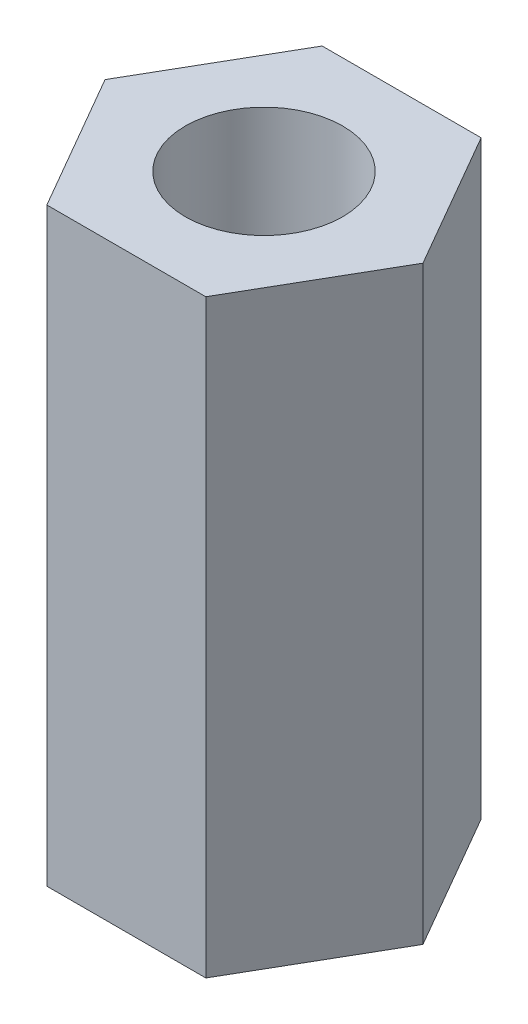
ISO-10303-21;
HEADER;
FILE_DESCRIPTION(('STEP AP214'),'2;1');
FILE_NAME('part.step','',(''),(''),'','','');
FILE_SCHEMA(('AUTOMOTIVE_DESIGN { 1 0 10303 214 1 1 1 1 }'));
ENDSEC;
DATA;
#1=APPLICATION_CONTEXT('core data for automotive mechanical design processes');
#2=APPLICATION_PROTOCOL_DEFINITION('international standard','automotive_design',2000,#1);
#3=PRODUCT_CONTEXT('',#1,'mechanical');
#4=PRODUCT('Part','Part','',(#3));
#5=PRODUCT_RELATED_PRODUCT_CATEGORY('part','',(#4));
#6=PRODUCT_DEFINITION_FORMATION('','',#4);
#7=PRODUCT_DEFINITION_CONTEXT('part definition',#1,'design');
#8=PRODUCT_DEFINITION('design','',#6,#7);
#9=PRODUCT_DEFINITION_SHAPE('','',#8);
#10=(LENGTH_UNIT() NAMED_UNIT(*) SI_UNIT(.MILLI.,.METRE.));
#11=(NAMED_UNIT(*) PLANE_ANGLE_UNIT() SI_UNIT($,.RADIAN.));
#12=(NAMED_UNIT(*) SI_UNIT($,.STERADIAN.) SOLID_ANGLE_UNIT());
#13=UNCERTAINTY_MEASURE_WITH_UNIT(LENGTH_MEASURE(1.E-05),#10,'distance_accuracy_value','');
#14=(GEOMETRIC_REPRESENTATION_CONTEXT(3) GLOBAL_UNCERTAINTY_ASSIGNED_CONTEXT((#13)) GLOBAL_UNIT_ASSIGNED_CONTEXT((#10,
#11,#12)) REPRESENTATION_CONTEXT('',''));
#15=CARTESIAN_POINT('',(0.,0.,0.));
#16=DIRECTION('',(0.,0.,1.));
#17=DIRECTION('',(1.,0.,0.));
#18=AXIS2_PLACEMENT_3D('',#15,#16,#17);
#19=CARTESIAN_POINT('',(0.,15.,0.));
#20=DIRECTION('',(0.,1.,0.));
#21=DIRECTION('',(0.,0.,1.));
#22=AXIS2_PLACEMENT_3D('',#19,#20,#21);
#23=PLANE('',#22);
#24=DIRECTION('',(0.5,0.,-0.866025403784439));
#25=VECTOR('',#24,1.);
#26=CARTESIAN_POINT('',(2.02072594216369,15.,3.5));
#27=LINE('',#26,#25);
#28=CARTESIAN_POINT('',(2.02072594216369,15.,3.5));
#29=VERTEX_POINT('',#28);
#30=CARTESIAN_POINT('',(4.04145188432738,15.,0.));
#31=VERTEX_POINT('',#30);
#32=EDGE_CURVE('E131',#29,#31,#27,.T.);
#33=ORIENTED_EDGE('',*,*,#32,.T.);
#34=DIRECTION('',(-0.5,0.,-0.866025403784439));
#35=VECTOR('',#34,1.);
#36=CARTESIAN_POINT('',(4.04145188432738,15.,0.));
#37=LINE('',#36,#35);
#38=CARTESIAN_POINT('',(2.02072594216369,15.,-3.5));
#39=VERTEX_POINT('',#38);
#40=EDGE_CURVE('E89',#31,#39,#37,.T.);
#41=ORIENTED_EDGE('',*,*,#40,.T.);
#42=DIRECTION('',(-1.,0.,0.));
#43=VECTOR('',#42,1.);
#44=CARTESIAN_POINT('',(2.02072594216369,15.,-3.5));
#45=LINE('',#44,#43);
#46=CARTESIAN_POINT('',(-2.02072594216369,15.,-3.5));
#47=VERTEX_POINT('',#46);
#48=EDGE_CURVE('E102',#39,#47,#45,.T.);
#49=ORIENTED_EDGE('',*,*,#48,.T.);
#50=DIRECTION('',(-0.5,0.,0.866025403784439));
#51=VECTOR('',#50,1.);
#52=CARTESIAN_POINT('',(-2.02072594216369,15.,-3.5));
#53=LINE('',#52,#51);
#54=CARTESIAN_POINT('',(-4.04145188432738,15.,0.));
#55=VERTEX_POINT('',#54);
#56=EDGE_CURVE('E96',#47,#55,#53,.T.);
#57=ORIENTED_EDGE('',*,*,#56,.T.);
#58=DIRECTION('',(0.5,0.,0.866025403784439));
#59=VECTOR('',#58,1.);
#60=CARTESIAN_POINT('',(-4.04145188432738,15.,0.));
#61=LINE('',#60,#59);
#62=CARTESIAN_POINT('',(-2.02072594216369,15.,3.5));
#63=VERTEX_POINT('',#62);
#64=EDGE_CURVE('E100',#55,#63,#61,.T.);
#65=ORIENTED_EDGE('',*,*,#64,.T.);
#66=DIRECTION('',(1.,0.,0.));
#67=VECTOR('',#66,1.);
#68=CARTESIAN_POINT('',(-2.02072594216369,15.,3.5));
#69=LINE('',#68,#67);
#70=EDGE_CURVE('E52',#63,#29,#69,.T.);
#71=ORIENTED_EDGE('',*,*,#70,.T.);
#72=EDGE_LOOP('',(#33,#41,#49,#57,#65,#71));
#73=FACE_BOUND('',#72,.T.);
#74=CARTESIAN_POINT('',(0.,15.,0.));
#75=DIRECTION('',(0.,1.,0.));
#76=DIRECTION('',(0.,0.,1.));
#77=AXIS2_PLACEMENT_3D('',#74,#75,#76);
#78=CIRCLE('',#77,2.);
#79=CARTESIAN_POINT('',(0.,15.,2.));
#80=VERTEX_POINT('',#79);
#81=EDGE_CURVE('E124',#80,#80,#78,.T.);
#82=ORIENTED_EDGE('',*,*,#81,.F.);
#83=EDGE_LOOP('',(#82));
#84=FACE_BOUND('',#83,.T.);
#85=ADVANCED_FACE('F35',(#73,#84),#23,.T.);
#86=CARTESIAN_POINT('',(0.,0.,0.));
#87=DIRECTION('',(0.,1.,0.));
#88=DIRECTION('',(0.,0.,1.));
#89=AXIS2_PLACEMENT_3D('',#86,#87,#88);
#90=PLANE('',#89);
#91=DIRECTION('',(0.5,0.,-0.866025403784439));
#92=VECTOR('',#91,1.);
#93=CARTESIAN_POINT('',(2.02072594216369,0.,3.5));
#94=LINE('',#93,#92);
#95=CARTESIAN_POINT('',(2.02072594216369,0.,3.5));
#96=VERTEX_POINT('',#95);
#97=CARTESIAN_POINT('',(4.04145188432738,0.,0.));
#98=VERTEX_POINT('',#97);
#99=EDGE_CURVE('E120',#96,#98,#94,.T.);
#100=ORIENTED_EDGE('',*,*,#99,.F.);
#101=DIRECTION('',(1.,0.,0.));
#102=VECTOR('',#101,1.);
#103=CARTESIAN_POINT('',(-2.02072594216369,0.,3.5));
#104=LINE('',#103,#102);
#105=CARTESIAN_POINT('',(-2.02072594216369,0.,3.5));
#106=VERTEX_POINT('',#105);
#107=EDGE_CURVE('E81',#106,#96,#104,.T.);
#108=ORIENTED_EDGE('',*,*,#107,.F.);
#109=DIRECTION('',(0.5,0.,0.866025403784439));
#110=VECTOR('',#109,1.);
#111=CARTESIAN_POINT('',(-4.04145188432738,0.,0.));
#112=LINE('',#111,#110);
#113=CARTESIAN_POINT('',(-4.04145188432738,0.,0.));
#114=VERTEX_POINT('',#113);
#115=EDGE_CURVE('E75',#114,#106,#112,.T.);
#116=ORIENTED_EDGE('',*,*,#115,.F.);
#117=DIRECTION('',(-0.5,0.,0.866025403784439));
#118=VECTOR('',#117,1.);
#119=CARTESIAN_POINT('',(-2.02072594216369,0.,-3.5));
#120=LINE('',#119,#118);
#121=CARTESIAN_POINT('',(-2.02072594216369,0.,-3.5));
#122=VERTEX_POINT('',#121);
#123=EDGE_CURVE('E110',#122,#114,#120,.T.);
#124=ORIENTED_EDGE('',*,*,#123,.F.);
#125=DIRECTION('',(-1.,0.,0.));
#126=VECTOR('',#125,1.);
#127=CARTESIAN_POINT('',(2.02072594216369,0.,-3.5));
#128=LINE('',#127,#126);
#129=CARTESIAN_POINT('',(2.02072594216369,0.,-3.5));
#130=VERTEX_POINT('',#129);
#131=EDGE_CURVE('E126',#130,#122,#128,.T.);
#132=ORIENTED_EDGE('',*,*,#131,.F.);
#133=DIRECTION('',(-0.5,0.,-0.866025403784439));
#134=VECTOR('',#133,1.);
#135=CARTESIAN_POINT('',(4.04145188432738,0.,0.));
#136=LINE('',#135,#134);
#137=EDGE_CURVE('E123',#98,#130,#136,.T.);
#138=ORIENTED_EDGE('',*,*,#137,.F.);
#139=EDGE_LOOP('',(#100,#108,#116,#124,#132,#138));
#140=FACE_BOUND('',#139,.T.);
#141=CARTESIAN_POINT('',(0.,0.,0.));
#142=DIRECTION('',(0.,1.,0.));
#143=DIRECTION('',(0.,0.,1.));
#144=AXIS2_PLACEMENT_3D('',#141,#142,#143);
#145=CIRCLE('',#144,2.);
#146=CARTESIAN_POINT('',(0.,0.,2.));
#147=VERTEX_POINT('',#146);
#148=EDGE_CURVE('E224',#147,#147,#145,.T.);
#149=ORIENTED_EDGE('',*,*,#148,.T.);
#150=EDGE_LOOP('',(#149));
#151=FACE_BOUND('',#150,.T.);
#152=ADVANCED_FACE('F140',(#140,#151),#90,.F.);
#153=CARTESIAN_POINT('',(2.02072594216369,15.,3.5));
#154=DIRECTION('',(-0.866025403784439,0.,-0.5));
#155=DIRECTION('',(-0.5,0.,0.866025403784439));
#156=AXIS2_PLACEMENT_3D('',#153,#154,#155);
#157=PLANE('',#156);
#158=ORIENTED_EDGE('',*,*,#99,.T.);
#159=DIRECTION('',(0.,-1.,0.));
#160=VECTOR('',#159,1.);
#161=CARTESIAN_POINT('',(4.04145188432738,15.,0.));
#162=LINE('',#161,#160);
#163=EDGE_CURVE('E11',#31,#98,#162,.T.);
#164=ORIENTED_EDGE('',*,*,#163,.F.);
#165=ORIENTED_EDGE('',*,*,#32,.F.);
#166=DIRECTION('',(0.,-1.,0.));
#167=VECTOR('',#166,1.);
#168=CARTESIAN_POINT('',(2.02072594216369,15.,3.5));
#169=LINE('',#168,#167);
#170=EDGE_CURVE('E116',#29,#96,#169,.T.);
#171=ORIENTED_EDGE('',*,*,#170,.T.);
#172=EDGE_LOOP('',(#158,#164,#165,#171));
#173=FACE_BOUND('',#172,.T.);
#174=ADVANCED_FACE('F37',(#173),#157,.F.);
#175=CARTESIAN_POINT('',(4.04145188432738,15.,0.));
#176=DIRECTION('',(-0.866025403784438,0.,0.5));
#177=DIRECTION('',(0.5,0.,0.866025403784439));
#178=AXIS2_PLACEMENT_3D('',#175,#176,#177);
#179=PLANE('',#178);
#180=ORIENTED_EDGE('',*,*,#137,.T.);
#181=DIRECTION('',(0.,-1.,0.));
#182=VECTOR('',#181,1.);
#183=CARTESIAN_POINT('',(2.02072594216369,15.,-3.5));
#184=LINE('',#183,#182);
#185=EDGE_CURVE('E44',#39,#130,#184,.T.);
#186=ORIENTED_EDGE('',*,*,#185,.F.);
#187=ORIENTED_EDGE('',*,*,#40,.F.);
#188=ORIENTED_EDGE('',*,*,#163,.T.);
#189=EDGE_LOOP('',(#180,#186,#187,#188));
#190=FACE_BOUND('',#189,.T.);
#191=ADVANCED_FACE('F165',(#190),#179,.F.);
#192=CARTESIAN_POINT('',(2.02072594216369,15.,-3.5));
#193=DIRECTION('',(0.,0.,1.));
#194=DIRECTION('',(1.,0.,0.));
#195=AXIS2_PLACEMENT_3D('',#192,#193,#194);
#196=PLANE('',#195);
#197=ORIENTED_EDGE('',*,*,#131,.T.);
#198=DIRECTION('',(0.,-1.,0.));
#199=VECTOR('',#198,1.);
#200=CARTESIAN_POINT('',(-2.02072594216369,15.,-3.5));
#201=LINE('',#200,#199);
#202=EDGE_CURVE('E111',#47,#122,#201,.T.);
#203=ORIENTED_EDGE('',*,*,#202,.F.);
#204=ORIENTED_EDGE('',*,*,#48,.F.);
#205=ORIENTED_EDGE('',*,*,#185,.T.);
#206=EDGE_LOOP('',(#197,#203,#204,#205));
#207=FACE_BOUND('',#206,.T.);
#208=ADVANCED_FACE('F137',(#207),#196,.F.);
#209=CARTESIAN_POINT('',(-2.02072594216369,15.,-3.5));
#210=DIRECTION('',(0.866025403784439,0.,0.5));
#211=DIRECTION('',(0.5,0.,-0.866025403784439));
#212=AXIS2_PLACEMENT_3D('',#209,#210,#211);
#213=PLANE('',#212);
#214=ORIENTED_EDGE('',*,*,#123,.T.);
#215=DIRECTION('',(0.,-1.,0.));
#216=VECTOR('',#215,1.);
#217=CARTESIAN_POINT('',(-4.04145188432738,15.,0.));
#218=LINE('',#217,#216);
#219=EDGE_CURVE('E107',#55,#114,#218,.T.);
#220=ORIENTED_EDGE('',*,*,#219,.F.);
#221=ORIENTED_EDGE('',*,*,#56,.F.);
#222=ORIENTED_EDGE('',*,*,#202,.T.);
#223=EDGE_LOOP('',(#214,#220,#221,#222));
#224=FACE_BOUND('',#223,.T.);
#225=ADVANCED_FACE('F108',(#224),#213,.F.);
#226=CARTESIAN_POINT('',(-4.04145188432738,15.,0.));
#227=DIRECTION('',(0.866025403784438,0.,-0.5));
#228=DIRECTION('',(-0.5,0.,-0.866025403784439));
#229=AXIS2_PLACEMENT_3D('',#226,#227,#228);
#230=PLANE('',#229);
#231=ORIENTED_EDGE('',*,*,#115,.T.);
#232=DIRECTION('',(0.,-1.,0.));
#233=VECTOR('',#232,1.);
#234=CARTESIAN_POINT('',(-2.02072594216369,15.,3.5));
#235=LINE('',#234,#233);
#236=EDGE_CURVE('E112',#63,#106,#235,.T.);
#237=ORIENTED_EDGE('',*,*,#236,.F.);
#238=ORIENTED_EDGE('',*,*,#64,.F.);
#239=ORIENTED_EDGE('',*,*,#219,.T.);
#240=EDGE_LOOP('',(#231,#237,#238,#239));
#241=FACE_BOUND('',#240,.T.);
#242=ADVANCED_FACE('F114',(#241),#230,.F.);
#243=CARTESIAN_POINT('',(-2.02072594216369,15.,3.5));
#244=DIRECTION('',(0.,0.,-1.));
#245=DIRECTION('',(-1.,0.,0.));
#246=AXIS2_PLACEMENT_3D('',#243,#244,#245);
#247=PLANE('',#246);
#248=ORIENTED_EDGE('',*,*,#107,.T.);
#249=ORIENTED_EDGE('',*,*,#170,.F.);
#250=ORIENTED_EDGE('',*,*,#70,.F.);
#251=ORIENTED_EDGE('',*,*,#236,.T.);
#252=EDGE_LOOP('',(#248,#249,#250,#251));
#253=FACE_BOUND('',#252,.T.);
#254=ADVANCED_FACE('F145',(#253),#247,.F.);
#255=CARTESIAN_POINT('',(0.,15.,0.));
#256=DIRECTION('',(0.,-1.,0.));
#257=DIRECTION('',(0.,0.,-1.));
#258=AXIS2_PLACEMENT_3D('',#255,#256,#257);
#259=CYLINDRICAL_SURFACE('',#258,2.);
#260=ORIENTED_EDGE('',*,*,#81,.T.);
#261=EDGE_LOOP('',(#260));
#262=FACE_BOUND('',#261,.T.);
#263=ORIENTED_EDGE('',*,*,#148,.F.);
#264=EDGE_LOOP('',(#263));
#265=FACE_BOUND('',#264,.T.);
#266=ADVANCED_FACE('F147',(#262,#265),#259,.F.);
#267=CLOSED_SHELL('',(#85,#152,#174,#191,#208,#225,#242,#254,#266));
#268=MANIFOLD_SOLID_BREP('B2',#267);
#269=ADVANCED_BREP_SHAPE_REPRESENTATION('',(#18,#268),#14);
#270=SHAPE_DEFINITION_REPRESENTATION(#9,#269);
ENDSEC;
END-ISO-10303-21;
